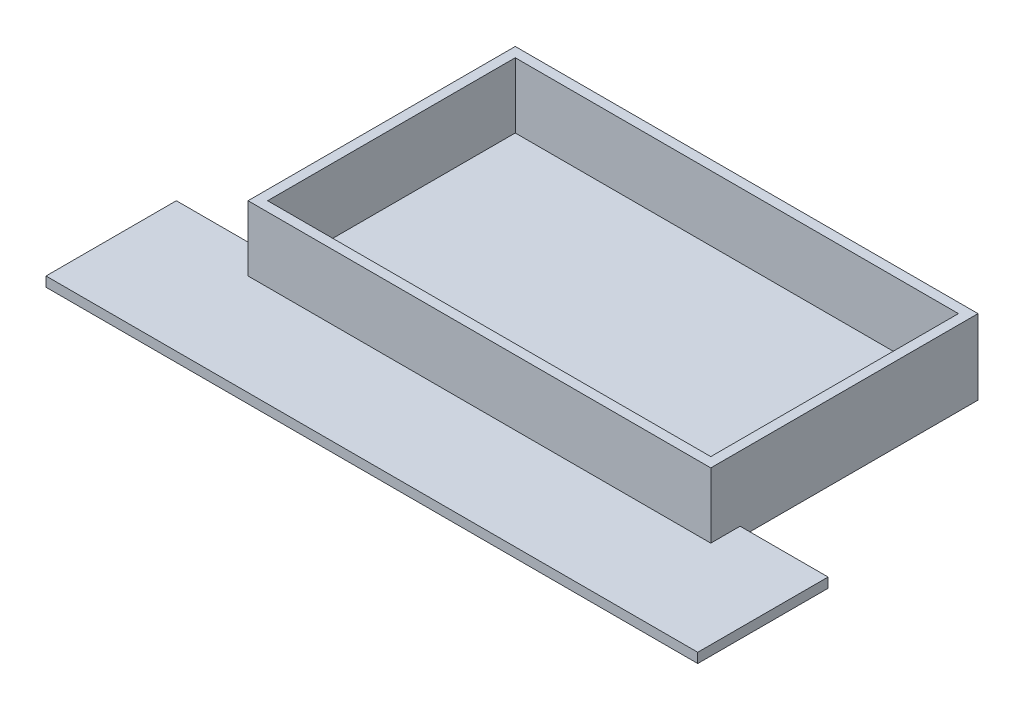
ISO-10303-21;
HEADER;
FILE_DESCRIPTION(('STEP AP214'),'2;1');
FILE_NAME('part.step','',(''),(''),'','','');
FILE_SCHEMA(('AUTOMOTIVE_DESIGN { 1 0 10303 214 1 1 1 1 }'));
ENDSEC;
DATA;
#1=APPLICATION_CONTEXT('core data for automotive mechanical design processes');
#2=APPLICATION_PROTOCOL_DEFINITION('international standard','automotive_design',2000,#1);
#3=PRODUCT_CONTEXT('',#1,'mechanical');
#4=PRODUCT('Part','Part','',(#3));
#5=PRODUCT_RELATED_PRODUCT_CATEGORY('part','',(#4));
#6=PRODUCT_DEFINITION_FORMATION('','',#4);
#7=PRODUCT_DEFINITION_CONTEXT('part definition',#1,'design');
#8=PRODUCT_DEFINITION('design','',#6,#7);
#9=PRODUCT_DEFINITION_SHAPE('','',#8);
#10=(LENGTH_UNIT() NAMED_UNIT(*) SI_UNIT(.MILLI.,.METRE.));
#11=(NAMED_UNIT(*) PLANE_ANGLE_UNIT() SI_UNIT($,.RADIAN.));
#12=(NAMED_UNIT(*) SI_UNIT($,.STERADIAN.) SOLID_ANGLE_UNIT());
#13=UNCERTAINTY_MEASURE_WITH_UNIT(LENGTH_MEASURE(1.E-05),#10,'distance_accuracy_value','');
#14=(GEOMETRIC_REPRESENTATION_CONTEXT(3) GLOBAL_UNCERTAINTY_ASSIGNED_CONTEXT((#13)) GLOBAL_UNIT_ASSIGNED_CONTEXT((#10,
#11,#12)) REPRESENTATION_CONTEXT('',''));
#15=CARTESIAN_POINT('',(0.,0.,0.));
#16=DIRECTION('',(0.,0.,1.));
#17=DIRECTION('',(1.,0.,0.));
#18=AXIS2_PLACEMENT_3D('',#15,#16,#17);
#19=CARTESIAN_POINT('',(0.,1.5,41.));
#20=DIRECTION('',(0.,0.,-1.));
#21=DIRECTION('',(-1.,0.,0.));
#22=AXIS2_PLACEMENT_3D('',#19,#20,#21);
#23=PLANE('',#22);
#24=DIRECTION('',(-1.,0.,0.));
#25=VECTOR('',#24,1.);
#26=CARTESIAN_POINT('',(0.,1.5,41.));
#27=LINE('',#26,#25);
#28=CARTESIAN_POINT('',(71.,1.5,41.));
#29=VERTEX_POINT('',#28);
#30=CARTESIAN_POINT('',(0.,1.5,41.));
#31=VERTEX_POINT('',#30);
#32=EDGE_CURVE('E183',#29,#31,#27,.T.);
#33=ORIENTED_EDGE('',*,*,#32,.F.);
#34=DIRECTION('',(0.,-1.,0.));
#35=VECTOR('',#34,1.);
#36=CARTESIAN_POINT('',(71.,1.5,41.));
#37=LINE('',#36,#35);
#38=CARTESIAN_POINT('',(71.,11.5,41.));
#39=VERTEX_POINT('',#38);
#40=EDGE_CURVE('E239',#39,#29,#37,.T.);
#41=ORIENTED_EDGE('',*,*,#40,.F.);
#42=DIRECTION('',(1.,0.,0.));
#43=VECTOR('',#42,1.);
#44=CARTESIAN_POINT('',(0.,11.5,41.));
#45=LINE('',#44,#43);
#46=CARTESIAN_POINT('',(0.,11.5,41.));
#47=VERTEX_POINT('',#46);
#48=EDGE_CURVE('E218',#47,#39,#45,.T.);
#49=ORIENTED_EDGE('',*,*,#48,.F.);
#50=DIRECTION('',(0.,-1.,0.));
#51=VECTOR('',#50,1.);
#52=CARTESIAN_POINT('',(0.,1.5,41.));
#53=LINE('',#52,#51);
#54=EDGE_CURVE('E43',#47,#31,#53,.T.);
#55=ORIENTED_EDGE('',*,*,#54,.T.);
#56=EDGE_LOOP('',(#33,#41,#49,#55));
#57=FACE_BOUND('',#56,.T.);
#58=ADVANCED_FACE('F35',(#57),#23,.F.);
#59=CARTESIAN_POINT('',(0.,1.5,0.));
#60=DIRECTION('',(1.,0.,0.));
#61=DIRECTION('',(0.,0.,-1.));
#62=AXIS2_PLACEMENT_3D('',#59,#60,#61);
#63=PLANE('',#62);
#64=DIRECTION('',(0.,0.,1.));
#65=VECTOR('',#64,1.);
#66=CARTESIAN_POINT('',(0.,0.,0.));
#67=LINE('',#66,#65);
#68=CARTESIAN_POINT('',(0.,0.,0.));
#69=VERTEX_POINT('',#68);
#70=CARTESIAN_POINT('',(0.,0.,36.5));
#71=VERTEX_POINT('',#70);
#72=EDGE_CURVE('E227',#69,#71,#67,.T.);
#73=ORIENTED_EDGE('',*,*,#72,.T.);
#74=DIRECTION('',(0.,1.,0.));
#75=VECTOR('',#74,1.);
#76=CARTESIAN_POINT('',(0.,1.5,36.5));
#77=LINE('',#76,#75);
#78=CARTESIAN_POINT('',(0.,1.5,36.5));
#79=VERTEX_POINT('',#78);
#80=EDGE_CURVE('E50',#71,#79,#77,.T.);
#81=ORIENTED_EDGE('',*,*,#80,.T.);
#82=DIRECTION('',(0.,0.,-1.));
#83=VECTOR('',#82,1.);
#84=CARTESIAN_POINT('',(0.,1.5,0.));
#85=LINE('',#84,#83);
#86=EDGE_CURVE('E54',#31,#79,#85,.T.);
#87=ORIENTED_EDGE('',*,*,#86,.F.);
#88=ORIENTED_EDGE('',*,*,#54,.F.);
#89=DIRECTION('',(0.,0.,1.));
#90=VECTOR('',#89,1.);
#91=CARTESIAN_POINT('',(0.,11.5,41.));
#92=LINE('',#91,#90);
#93=CARTESIAN_POINT('',(0.,11.5,0.));
#94=VERTEX_POINT('',#93);
#95=EDGE_CURVE('E215',#94,#47,#92,.T.);
#96=ORIENTED_EDGE('',*,*,#95,.F.);
#97=DIRECTION('',(0.,-1.,0.));
#98=VECTOR('',#97,1.);
#99=CARTESIAN_POINT('',(0.,1.5,0.));
#100=LINE('',#99,#98);
#101=EDGE_CURVE('E233',#94,#69,#100,.T.);
#102=ORIENTED_EDGE('',*,*,#101,.T.);
#103=EDGE_LOOP('',(#73,#81,#87,#88,#96,#102));
#104=FACE_BOUND('',#103,.T.);
#105=ADVANCED_FACE('F37',(#104),#63,.F.);
#106=CARTESIAN_POINT('',(71.,1.5,0.));
#107=DIRECTION('',(-1.,0.,0.));
#108=DIRECTION('',(0.,0.,1.));
#109=AXIS2_PLACEMENT_3D('',#106,#107,#108);
#110=PLANE('',#109);
#111=DIRECTION('',(0.,0.,1.));
#112=VECTOR('',#111,1.);
#113=CARTESIAN_POINT('',(71.,1.5,0.));
#114=LINE('',#113,#112);
#115=CARTESIAN_POINT('',(71.,1.5,36.5));
#116=VERTEX_POINT('',#115);
#117=EDGE_CURVE('E11',#116,#29,#114,.T.);
#118=ORIENTED_EDGE('',*,*,#117,.F.);
#119=DIRECTION('',(0.,-1.,0.));
#120=VECTOR('',#119,1.);
#121=CARTESIAN_POINT('',(71.,1.5,36.5));
#122=LINE('',#121,#120);
#123=CARTESIAN_POINT('',(71.,0.,36.5));
#124=VERTEX_POINT('',#123);
#125=EDGE_CURVE('E175',#116,#124,#122,.T.);
#126=ORIENTED_EDGE('',*,*,#125,.T.);
#127=DIRECTION('',(0.,0.,-1.));
#128=VECTOR('',#127,1.);
#129=CARTESIAN_POINT('',(71.,0.,0.));
#130=LINE('',#129,#128);
#131=CARTESIAN_POINT('',(71.,0.,0.));
#132=VERTEX_POINT('',#131);
#133=EDGE_CURVE('E229',#124,#132,#130,.T.);
#134=ORIENTED_EDGE('',*,*,#133,.T.);
#135=DIRECTION('',(0.,-1.,0.));
#136=VECTOR('',#135,1.);
#137=CARTESIAN_POINT('',(71.,1.5,0.));
#138=LINE('',#137,#136);
#139=CARTESIAN_POINT('',(71.,11.5,0.));
#140=VERTEX_POINT('',#139);
#141=EDGE_CURVE('E236',#140,#132,#138,.T.);
#142=ORIENTED_EDGE('',*,*,#141,.F.);
#143=DIRECTION('',(0.,0.,-1.));
#144=VECTOR('',#143,1.);
#145=CARTESIAN_POINT('',(71.,11.5,41.));
#146=LINE('',#145,#144);
#147=EDGE_CURVE('E221',#39,#140,#146,.T.);
#148=ORIENTED_EDGE('',*,*,#147,.F.);
#149=ORIENTED_EDGE('',*,*,#40,.T.);
#150=EDGE_LOOP('',(#118,#126,#134,#142,#148,#149));
#151=FACE_BOUND('',#150,.T.);
#152=ADVANCED_FACE('F248',(#151),#110,.F.);
#153=CARTESIAN_POINT('',(0.,1.5,0.));
#154=DIRECTION('',(0.,0.,1.));
#155=DIRECTION('',(1.,0.,0.));
#156=AXIS2_PLACEMENT_3D('',#153,#154,#155);
#157=PLANE('',#156);
#158=DIRECTION('',(-1.,0.,0.));
#159=VECTOR('',#158,1.);
#160=CARTESIAN_POINT('',(0.,0.,0.));
#161=LINE('',#160,#159);
#162=EDGE_CURVE('E231',#132,#69,#161,.T.);
#163=ORIENTED_EDGE('',*,*,#162,.T.);
#164=ORIENTED_EDGE('',*,*,#101,.F.);
#165=DIRECTION('',(-1.,0.,0.));
#166=VECTOR('',#165,1.);
#167=CARTESIAN_POINT('',(0.,11.5,0.));
#168=LINE('',#167,#166);
#169=EDGE_CURVE('E224',#140,#94,#168,.T.);
#170=ORIENTED_EDGE('',*,*,#169,.F.);
#171=ORIENTED_EDGE('',*,*,#141,.T.);
#172=EDGE_LOOP('',(#163,#164,#170,#171));
#173=FACE_BOUND('',#172,.T.);
#174=ADVANCED_FACE('F262',(#173),#157,.F.);
#175=CARTESIAN_POINT('',(0.,0.,0.));
#176=DIRECTION('',(0.,1.,0.));
#177=DIRECTION('',(0.,0.,1.));
#178=AXIS2_PLACEMENT_3D('',#175,#176,#177);
#179=PLANE('',#178);
#180=ORIENTED_EDGE('',*,*,#133,.F.);
#181=DIRECTION('',(1.,0.,0.));
#182=VECTOR('',#181,1.);
#183=CARTESIAN_POINT('',(-15.5,0.,36.5));
#184=LINE('',#183,#182);
#185=CARTESIAN_POINT('',(84.5,0.,36.5));
#186=VERTEX_POINT('',#185);
#187=EDGE_CURVE('E170',#124,#186,#184,.T.);
#188=ORIENTED_EDGE('',*,*,#187,.T.);
#189=DIRECTION('',(0.,0.,1.));
#190=VECTOR('',#189,1.);
#191=CARTESIAN_POINT('',(84.5,0.,56.5));
#192=LINE('',#191,#190);
#193=CARTESIAN_POINT('',(84.5,0.,56.5));
#194=VERTEX_POINT('',#193);
#195=EDGE_CURVE('E162',#186,#194,#192,.T.);
#196=ORIENTED_EDGE('',*,*,#195,.T.);
#197=DIRECTION('',(-1.,0.,0.));
#198=VECTOR('',#197,1.);
#199=CARTESIAN_POINT('',(-15.5,0.,56.5));
#200=LINE('',#199,#198);
#201=CARTESIAN_POINT('',(-15.5,0.,56.5));
#202=VERTEX_POINT('',#201);
#203=EDGE_CURVE('E159',#194,#202,#200,.T.);
#204=ORIENTED_EDGE('',*,*,#203,.T.);
#205=DIRECTION('',(0.,0.,-1.));
#206=VECTOR('',#205,1.);
#207=CARTESIAN_POINT('',(-15.5,0.,56.5));
#208=LINE('',#207,#206);
#209=CARTESIAN_POINT('',(-15.5,0.,36.5));
#210=VERTEX_POINT('',#209);
#211=EDGE_CURVE('E168',#202,#210,#208,.T.);
#212=ORIENTED_EDGE('',*,*,#211,.T.);
#213=EDGE_CURVE('E139',#210,#71,#184,.T.);
#214=ORIENTED_EDGE('',*,*,#213,.T.);
#215=ORIENTED_EDGE('',*,*,#72,.F.);
#216=ORIENTED_EDGE('',*,*,#162,.F.);
#217=EDGE_LOOP('',(#180,#188,#196,#204,#212,#214,#215,#216));
#218=FACE_BOUND('',#217,.T.);
#219=ADVANCED_FACE('F256',(#218),#179,.F.);
#220=CARTESIAN_POINT('',(0.,11.5,0.));
#221=DIRECTION('',(0.,-1.,0.));
#222=DIRECTION('',(0.,0.,-1.));
#223=AXIS2_PLACEMENT_3D('',#220,#221,#222);
#224=PLANE('',#223);
#225=ORIENTED_EDGE('',*,*,#95,.T.);
#226=ORIENTED_EDGE('',*,*,#48,.T.);
#227=ORIENTED_EDGE('',*,*,#147,.T.);
#228=ORIENTED_EDGE('',*,*,#169,.T.);
#229=EDGE_LOOP('',(#225,#226,#227,#228));
#230=FACE_BOUND('',#229,.T.);
#231=DIRECTION('',(1.,0.,0.));
#232=VECTOR('',#231,1.);
#233=CARTESIAN_POINT('',(1.50000000000001,11.5,39.5));
#234=LINE('',#233,#232);
#235=CARTESIAN_POINT('',(1.50000000000001,11.5,39.5));
#236=VERTEX_POINT('',#235);
#237=CARTESIAN_POINT('',(69.5,11.5,39.5));
#238=VERTEX_POINT('',#237);
#239=EDGE_CURVE('E187',#236,#238,#234,.T.);
#240=ORIENTED_EDGE('',*,*,#239,.F.);
#241=DIRECTION('',(0.,0.,1.));
#242=VECTOR('',#241,1.);
#243=CARTESIAN_POINT('',(1.50000000000001,11.5,39.5));
#244=LINE('',#243,#242);
#245=CARTESIAN_POINT('',(1.50000000000001,11.5,1.5));
#246=VERTEX_POINT('',#245);
#247=EDGE_CURVE('E195',#246,#236,#244,.T.);
#248=ORIENTED_EDGE('',*,*,#247,.F.);
#249=DIRECTION('',(-1.,0.,0.));
#250=VECTOR('',#249,1.);
#251=CARTESIAN_POINT('',(1.50000000000001,11.5,1.5));
#252=LINE('',#251,#250);
#253=CARTESIAN_POINT('',(69.5,11.5,1.5));
#254=VERTEX_POINT('',#253);
#255=EDGE_CURVE('E192',#254,#246,#252,.T.);
#256=ORIENTED_EDGE('',*,*,#255,.F.);
#257=DIRECTION('',(0.,0.,-1.));
#258=VECTOR('',#257,1.);
#259=CARTESIAN_POINT('',(69.5,11.5,39.5));
#260=LINE('',#259,#258);
#261=EDGE_CURVE('E189',#238,#254,#260,.T.);
#262=ORIENTED_EDGE('',*,*,#261,.F.);
#263=EDGE_LOOP('',(#240,#248,#256,#262));
#264=FACE_BOUND('',#263,.T.);
#265=ADVANCED_FACE('F264',(#230,#264),#224,.F.);
#266=CARTESIAN_POINT('',(1.50000000000001,11.5,39.5));
#267=DIRECTION('',(0.,0.,-1.));
#268=DIRECTION('',(-1.,0.,0.));
#269=AXIS2_PLACEMENT_3D('',#266,#267,#268);
#270=PLANE('',#269);
#271=DIRECTION('',(1.,0.,0.));
#272=VECTOR('',#271,1.);
#273=CARTESIAN_POINT('',(1.50000000000001,1.5,39.5));
#274=LINE('',#273,#272);
#275=CARTESIAN_POINT('',(1.50000000000001,1.5,39.5));
#276=VERTEX_POINT('',#275);
#277=CARTESIAN_POINT('',(69.5,1.5,39.5));
#278=VERTEX_POINT('',#277);
#279=EDGE_CURVE('E186',#276,#278,#274,.T.);
#280=ORIENTED_EDGE('',*,*,#279,.F.);
#281=DIRECTION('',(0.,-1.,0.));
#282=VECTOR('',#281,1.);
#283=CARTESIAN_POINT('',(1.50000000000001,11.5,39.5));
#284=LINE('',#283,#282);
#285=EDGE_CURVE('E197',#236,#276,#284,.T.);
#286=ORIENTED_EDGE('',*,*,#285,.F.);
#287=ORIENTED_EDGE('',*,*,#239,.T.);
#288=DIRECTION('',(0.,-1.,0.));
#289=VECTOR('',#288,1.);
#290=CARTESIAN_POINT('',(69.5,11.5,39.5));
#291=LINE('',#290,#289);
#292=EDGE_CURVE('E212',#238,#278,#291,.T.);
#293=ORIENTED_EDGE('',*,*,#292,.T.);
#294=EDGE_LOOP('',(#280,#286,#287,#293));
#295=FACE_BOUND('',#294,.T.);
#296=ADVANCED_FACE('F296',(#295),#270,.T.);
#297=CARTESIAN_POINT('',(69.5,11.5,39.5));
#298=DIRECTION('',(-1.,0.,0.));
#299=DIRECTION('',(0.,0.,1.));
#300=AXIS2_PLACEMENT_3D('',#297,#298,#299);
#301=PLANE('',#300);
#302=DIRECTION('',(0.,0.,-1.));
#303=VECTOR('',#302,1.);
#304=CARTESIAN_POINT('',(69.5,1.5,39.5));
#305=LINE('',#304,#303);
#306=CARTESIAN_POINT('',(69.5,1.5,1.5));
#307=VERTEX_POINT('',#306);
#308=EDGE_CURVE('E199',#278,#307,#305,.T.);
#309=ORIENTED_EDGE('',*,*,#308,.F.);
#310=ORIENTED_EDGE('',*,*,#292,.F.);
#311=ORIENTED_EDGE('',*,*,#261,.T.);
#312=DIRECTION('',(0.,-1.,0.));
#313=VECTOR('',#312,1.);
#314=CARTESIAN_POINT('',(69.5,11.5,1.5));
#315=LINE('',#314,#313);
#316=EDGE_CURVE('E209',#254,#307,#315,.T.);
#317=ORIENTED_EDGE('',*,*,#316,.T.);
#318=EDGE_LOOP('',(#309,#310,#311,#317));
#319=FACE_BOUND('',#318,.T.);
#320=ADVANCED_FACE('F299',(#319),#301,.T.);
#321=CARTESIAN_POINT('',(1.50000000000001,11.5,1.5));
#322=DIRECTION('',(0.,0.,1.));
#323=DIRECTION('',(1.,0.,0.));
#324=AXIS2_PLACEMENT_3D('',#321,#322,#323);
#325=PLANE('',#324);
#326=DIRECTION('',(-1.,0.,0.));
#327=VECTOR('',#326,1.);
#328=CARTESIAN_POINT('',(1.50000000000001,1.5,1.5));
#329=LINE('',#328,#327);
#330=CARTESIAN_POINT('',(1.50000000000001,1.5,1.5));
#331=VERTEX_POINT('',#330);
#332=EDGE_CURVE('E201',#307,#331,#329,.T.);
#333=ORIENTED_EDGE('',*,*,#332,.F.);
#334=ORIENTED_EDGE('',*,*,#316,.F.);
#335=ORIENTED_EDGE('',*,*,#255,.T.);
#336=DIRECTION('',(0.,-1.,0.));
#337=VECTOR('',#336,1.);
#338=CARTESIAN_POINT('',(1.50000000000001,11.5,1.5));
#339=LINE('',#338,#337);
#340=EDGE_CURVE('E206',#246,#331,#339,.T.);
#341=ORIENTED_EDGE('',*,*,#340,.T.);
#342=EDGE_LOOP('',(#333,#334,#335,#341));
#343=FACE_BOUND('',#342,.T.);
#344=ADVANCED_FACE('F303',(#343),#325,.T.);
#345=CARTESIAN_POINT('',(1.50000000000001,11.5,39.5));
#346=DIRECTION('',(1.,0.,0.));
#347=DIRECTION('',(0.,0.,-1.));
#348=AXIS2_PLACEMENT_3D('',#345,#346,#347);
#349=PLANE('',#348);
#350=DIRECTION('',(0.,0.,1.));
#351=VECTOR('',#350,1.);
#352=CARTESIAN_POINT('',(1.50000000000001,1.5,39.5));
#353=LINE('',#352,#351);
#354=EDGE_CURVE('E190',#331,#276,#353,.T.);
#355=ORIENTED_EDGE('',*,*,#354,.F.);
#356=ORIENTED_EDGE('',*,*,#340,.F.);
#357=ORIENTED_EDGE('',*,*,#247,.T.);
#358=ORIENTED_EDGE('',*,*,#285,.T.);
#359=EDGE_LOOP('',(#355,#356,#357,#358));
#360=FACE_BOUND('',#359,.T.);
#361=ADVANCED_FACE('F292',(#360),#349,.T.);
#362=CARTESIAN_POINT('',(0.,1.5,0.));
#363=DIRECTION('',(0.,1.,0.));
#364=DIRECTION('',(0.,0.,1.));
#365=AXIS2_PLACEMENT_3D('',#362,#363,#364);
#366=PLANE('',#365);
#367=ORIENTED_EDGE('',*,*,#308,.T.);
#368=ORIENTED_EDGE('',*,*,#332,.T.);
#369=ORIENTED_EDGE('',*,*,#354,.T.);
#370=ORIENTED_EDGE('',*,*,#279,.T.);
#371=EDGE_LOOP('',(#367,#368,#369,#370));
#372=FACE_BOUND('',#371,.T.);
#373=ADVANCED_FACE('F289',(#372),#366,.T.);
#374=CARTESIAN_POINT('',(0.,1.5,0.));
#375=DIRECTION('',(0.,-1.,0.));
#376=DIRECTION('',(0.,0.,-1.));
#377=AXIS2_PLACEMENT_3D('',#374,#375,#376);
#378=PLANE('',#377);
#379=ORIENTED_EDGE('',*,*,#32,.T.);
#380=ORIENTED_EDGE('',*,*,#86,.T.);
#381=DIRECTION('',(1.,0.,0.));
#382=VECTOR('',#381,1.);
#383=CARTESIAN_POINT('',(-15.5,1.5,36.5));
#384=LINE('',#383,#382);
#385=CARTESIAN_POINT('',(-15.5,1.5,36.5));
#386=VERTEX_POINT('',#385);
#387=EDGE_CURVE('E137',#386,#79,#384,.T.);
#388=ORIENTED_EDGE('',*,*,#387,.F.);
#389=DIRECTION('',(0.,0.,-1.));
#390=VECTOR('',#389,1.);
#391=CARTESIAN_POINT('',(-15.5,1.5,56.5));
#392=LINE('',#391,#390);
#393=CARTESIAN_POINT('',(-15.5,1.5,56.5));
#394=VERTEX_POINT('',#393);
#395=EDGE_CURVE('E152',#394,#386,#392,.T.);
#396=ORIENTED_EDGE('',*,*,#395,.F.);
#397=DIRECTION('',(-1.,0.,0.));
#398=VECTOR('',#397,1.);
#399=CARTESIAN_POINT('',(-15.5,1.5,56.5));
#400=LINE('',#399,#398);
#401=CARTESIAN_POINT('',(84.5,1.5,56.5));
#402=VERTEX_POINT('',#401);
#403=EDGE_CURVE('E145',#402,#394,#400,.T.);
#404=ORIENTED_EDGE('',*,*,#403,.F.);
#405=DIRECTION('',(0.,0.,1.));
#406=VECTOR('',#405,1.);
#407=CARTESIAN_POINT('',(84.5,1.5,56.5));
#408=LINE('',#407,#406);
#409=CARTESIAN_POINT('',(84.5,1.5,36.5));
#410=VERTEX_POINT('',#409);
#411=EDGE_CURVE('E154',#410,#402,#408,.T.);
#412=ORIENTED_EDGE('',*,*,#411,.F.);
#413=EDGE_CURVE('E155',#116,#410,#384,.T.);
#414=ORIENTED_EDGE('',*,*,#413,.F.);
#415=ORIENTED_EDGE('',*,*,#117,.T.);
#416=EDGE_LOOP('',(#379,#380,#388,#396,#404,#412,#414,#415));
#417=FACE_BOUND('',#416,.T.);
#418=ADVANCED_FACE('F150',(#417),#378,.F.);
#419=CARTESIAN_POINT('',(-15.5,1.5,36.5));
#420=DIRECTION('',(0.,0.,-1.));
#421=DIRECTION('',(-1.,0.,0.));
#422=AXIS2_PLACEMENT_3D('',#419,#420,#421);
#423=PLANE('',#422);
#424=ORIENTED_EDGE('',*,*,#80,.F.);
#425=ORIENTED_EDGE('',*,*,#213,.F.);
#426=DIRECTION('',(0.,-1.,0.));
#427=VECTOR('',#426,1.);
#428=CARTESIAN_POINT('',(-15.5,1.5,36.5));
#429=LINE('',#428,#427);
#430=EDGE_CURVE('E134',#386,#210,#429,.T.);
#431=ORIENTED_EDGE('',*,*,#430,.F.);
#432=ORIENTED_EDGE('',*,*,#387,.T.);
#433=EDGE_LOOP('',(#424,#425,#431,#432));
#434=FACE_BOUND('',#433,.T.);
#435=ADVANCED_FACE('F136',(#434),#423,.T.);
#436=ORIENTED_EDGE('',*,*,#125,.F.);
#437=ORIENTED_EDGE('',*,*,#413,.T.);
#438=DIRECTION('',(0.,-1.,0.));
#439=VECTOR('',#438,1.);
#440=CARTESIAN_POINT('',(84.5,1.5,36.5));
#441=LINE('',#440,#439);
#442=EDGE_CURVE('E144',#410,#186,#441,.T.);
#443=ORIENTED_EDGE('',*,*,#442,.T.);
#444=ORIENTED_EDGE('',*,*,#187,.F.);
#445=EDGE_LOOP('',(#436,#437,#443,#444));
#446=FACE_BOUND('',#445,.T.);
#447=ADVANCED_FACE('F252',(#446),#423,.T.);
#448=CARTESIAN_POINT('',(-15.5,1.5,56.5));
#449=DIRECTION('',(-1.,0.,0.));
#450=DIRECTION('',(0.,0.,1.));
#451=AXIS2_PLACEMENT_3D('',#448,#449,#450);
#452=PLANE('',#451);
#453=ORIENTED_EDGE('',*,*,#211,.F.);
#454=DIRECTION('',(0.,-1.,0.));
#455=VECTOR('',#454,1.);
#456=CARTESIAN_POINT('',(-15.5,1.5,56.5));
#457=LINE('',#456,#455);
#458=EDGE_CURVE('E158',#394,#202,#457,.T.);
#459=ORIENTED_EDGE('',*,*,#458,.F.);
#460=ORIENTED_EDGE('',*,*,#395,.T.);
#461=ORIENTED_EDGE('',*,*,#430,.T.);
#462=EDGE_LOOP('',(#453,#459,#460,#461));
#463=FACE_BOUND('',#462,.T.);
#464=ADVANCED_FACE('F157',(#463),#452,.T.);
#465=CARTESIAN_POINT('',(-15.5,1.5,56.5));
#466=DIRECTION('',(0.,0.,1.));
#467=DIRECTION('',(1.,0.,0.));
#468=AXIS2_PLACEMENT_3D('',#465,#466,#467);
#469=PLANE('',#468);
#470=ORIENTED_EDGE('',*,*,#203,.F.);
#471=DIRECTION('',(0.,-1.,0.));
#472=VECTOR('',#471,1.);
#473=CARTESIAN_POINT('',(84.5,1.5,56.5));
#474=LINE('',#473,#472);
#475=EDGE_CURVE('E176',#402,#194,#474,.T.);
#476=ORIENTED_EDGE('',*,*,#475,.F.);
#477=ORIENTED_EDGE('',*,*,#403,.T.);
#478=ORIENTED_EDGE('',*,*,#458,.T.);
#479=EDGE_LOOP('',(#470,#476,#477,#478));
#480=FACE_BOUND('',#479,.T.);
#481=ADVANCED_FACE('F267',(#480),#469,.T.);
#482=CARTESIAN_POINT('',(84.5,1.5,56.5));
#483=DIRECTION('',(1.,0.,0.));
#484=DIRECTION('',(0.,0.,-1.));
#485=AXIS2_PLACEMENT_3D('',#482,#483,#484);
#486=PLANE('',#485);
#487=ORIENTED_EDGE('',*,*,#195,.F.);
#488=ORIENTED_EDGE('',*,*,#442,.F.);
#489=ORIENTED_EDGE('',*,*,#411,.T.);
#490=ORIENTED_EDGE('',*,*,#475,.T.);
#491=EDGE_LOOP('',(#487,#488,#489,#490));
#492=FACE_BOUND('',#491,.T.);
#493=ADVANCED_FACE('F269',(#492),#486,.T.);
#494=CLOSED_SHELL('',(#58,#105,#152,#174,#219,#265,#296,#320,#344,#361,#373,#418,#435,#447,#464,
#481,#493));
#495=MANIFOLD_SOLID_BREP('B2',#494);
#496=ADVANCED_BREP_SHAPE_REPRESENTATION('',(#18,#495),#14);
#497=SHAPE_DEFINITION_REPRESENTATION(#9,#496);
ENDSEC;
END-ISO-10303-21;
